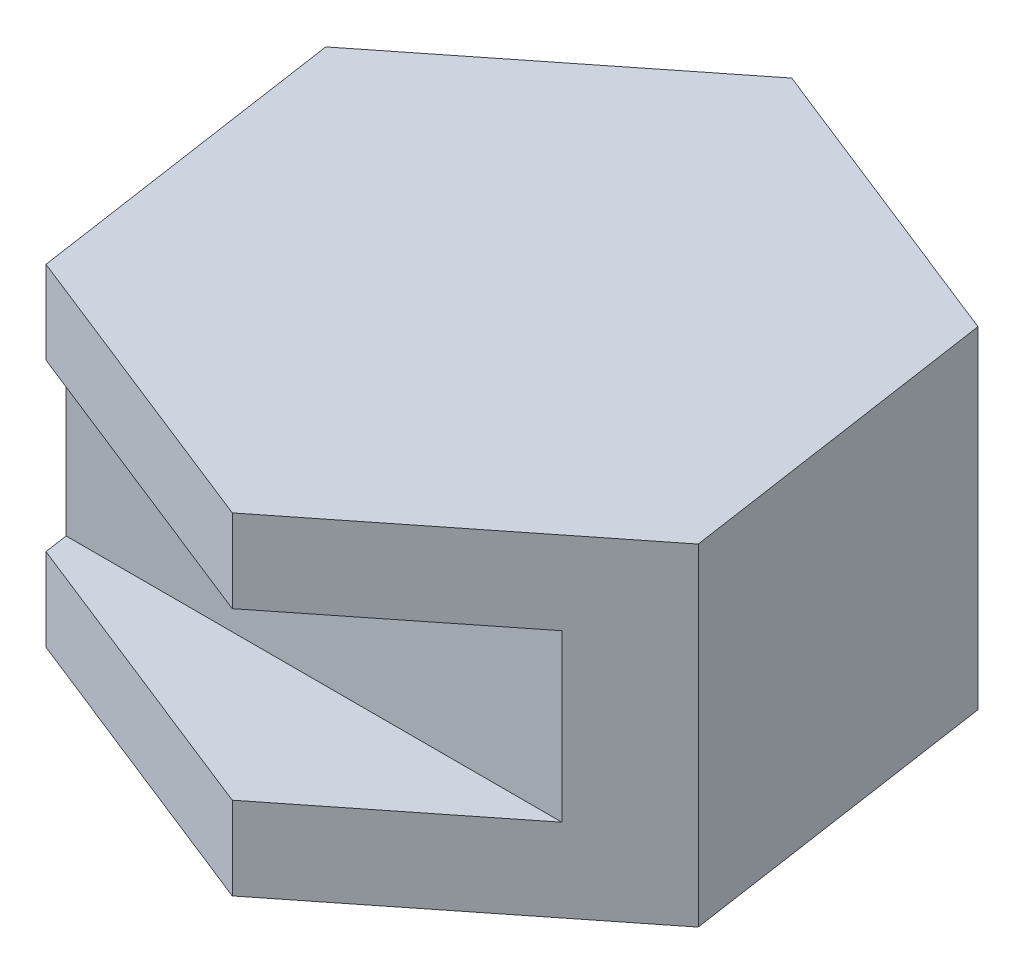
ISO-10303-21;
HEADER;
FILE_DESCRIPTION(('STEP AP214'),'2;1');
FILE_NAME('part.step','',(''),(''),'','','');
FILE_SCHEMA(('AUTOMOTIVE_DESIGN { 1 0 10303 214 1 1 1 1 }'));
ENDSEC;
DATA;
#1=APPLICATION_CONTEXT('core data for automotive mechanical design processes');
#2=APPLICATION_PROTOCOL_DEFINITION('international standard','automotive_design',2000,#1);
#3=PRODUCT_CONTEXT('',#1,'mechanical');
#4=PRODUCT('Part','Part','',(#3));
#5=PRODUCT_RELATED_PRODUCT_CATEGORY('part','',(#4));
#6=PRODUCT_DEFINITION_FORMATION('','',#4);
#7=PRODUCT_DEFINITION_CONTEXT('part definition',#1,'design');
#8=PRODUCT_DEFINITION('design','',#6,#7);
#9=PRODUCT_DEFINITION_SHAPE('','',#8);
#10=(LENGTH_UNIT() NAMED_UNIT(*) SI_UNIT(.MILLI.,.METRE.));
#11=(NAMED_UNIT(*) PLANE_ANGLE_UNIT() SI_UNIT($,.RADIAN.));
#12=(NAMED_UNIT(*) SI_UNIT($,.STERADIAN.) SOLID_ANGLE_UNIT());
#13=UNCERTAINTY_MEASURE_WITH_UNIT(LENGTH_MEASURE(1.E-05),#10,'distance_accuracy_value','');
#14=(GEOMETRIC_REPRESENTATION_CONTEXT(3) GLOBAL_UNCERTAINTY_ASSIGNED_CONTEXT((#13)) GLOBAL_UNIT_ASSIGNED_CONTEXT((#10,
#11,#12)) REPRESENTATION_CONTEXT('',''));
#15=CARTESIAN_POINT('',(0.,0.,0.));
#16=DIRECTION('',(0.,0.,1.));
#17=DIRECTION('',(1.,0.,0.));
#18=AXIS2_PLACEMENT_3D('',#15,#16,#17);
#19=CARTESIAN_POINT('',(4.78052116498155,10.,-15.1706895412915));
#20=DIRECTION('',(0.368239357538517,0.,-0.929731023231784));
#21=DIRECTION('',(-0.929731023231784,0.,-0.368239357538517));
#22=AXIS2_PLACEMENT_3D('',#19,#20,#21);
#23=PLANE('',#22);
#24=DIRECTION('',(0.929731023231784,0.,0.368239357538517));
#25=VECTOR('',#24,1.);
#26=CARTESIAN_POINT('',(4.78052116498155,2.5,-15.1706895412915));
#27=LINE('',#26,#25);
#28=CARTESIAN_POINT('',(4.78052116498155,2.5,-15.1706895412915));
#29=VERTEX_POINT('',#28);
#30=CARTESIAN_POINT('',(14.0778313972994,2.5,-11.4882959659064));
#31=VERTEX_POINT('',#30);
#32=EDGE_CURVE('E49',#29,#31,#27,.T.);
#33=ORIENTED_EDGE('',*,*,#32,.F.);
#34=DIRECTION('',(0.,-1.,0.));
#35=VECTOR('',#34,1.);
#36=CARTESIAN_POINT('',(4.78052116498155,10.,-15.1706895412915));
#37=LINE('',#36,#35);
#38=CARTESIAN_POINT('',(4.78052116498155,0.,-15.1706895412915));
#39=VERTEX_POINT('',#38);
#40=EDGE_CURVE('E123',#29,#39,#37,.T.);
#41=ORIENTED_EDGE('',*,*,#40,.T.);
#42=DIRECTION('',(0.929731023231784,0.,0.368239357538517));
#43=VECTOR('',#42,1.);
#44=CARTESIAN_POINT('',(4.78052116498155,0.,-15.1706895412915));
#45=LINE('',#44,#43);
#46=CARTESIAN_POINT('',(14.0778313972994,0.,-11.4882959659064));
#47=VERTEX_POINT('',#46);
#48=EDGE_CURVE('E142',#39,#47,#45,.T.);
#49=ORIENTED_EDGE('',*,*,#48,.T.);
#50=DIRECTION('',(0.,-1.,0.));
#51=VECTOR('',#50,1.);
#52=CARTESIAN_POINT('',(14.0778313972994,10.,-11.4882959659064));
#53=LINE('',#52,#51);
#54=EDGE_CURVE('E124',#31,#47,#53,.T.);
#55=ORIENTED_EDGE('',*,*,#54,.F.);
#56=EDGE_LOOP('',(#33,#41,#49,#55));
#57=FACE_BOUND('',#56,.T.);
#58=ADVANCED_FACE('F34',(#57),#23,.F.);
#59=CARTESIAN_POINT('',(20.4559241633317,10.,-27.5917096620109));
#60=DIRECTION('',(-0.368239357538516,0.,0.929731023231784));
#61=DIRECTION('',(0.929731023231784,0.,0.368239357538516));
#62=AXIS2_PLACEMENT_3D('',#59,#60,#61);
#63=PLANE('',#62);
#64=DIRECTION('',(-0.929731023231784,0.,-0.368239357538516));
#65=VECTOR('',#64,1.);
#66=CARTESIAN_POINT('',(20.4559241633317,0.,-27.5917096620109));
#67=LINE('',#66,#65);
#68=CARTESIAN_POINT('',(20.4559241633317,0.,-27.5917096620109));
#69=VERTEX_POINT('',#68);
#70=CARTESIAN_POINT('',(11.1586139310139,0.,-31.274103237396));
#71=VERTEX_POINT('',#70);
#72=EDGE_CURVE('E133',#69,#71,#67,.T.);
#73=ORIENTED_EDGE('',*,*,#72,.T.);
#74=DIRECTION('',(0.,-1.,0.));
#75=VECTOR('',#74,1.);
#76=CARTESIAN_POINT('',(11.1586139310139,10.,-31.274103237396));
#77=LINE('',#76,#75);
#78=CARTESIAN_POINT('',(11.1586139310139,10.,-31.274103237396));
#79=VERTEX_POINT('',#78);
#80=EDGE_CURVE('E156',#79,#71,#77,.T.);
#81=ORIENTED_EDGE('',*,*,#80,.F.);
#82=DIRECTION('',(-0.929731023231784,0.,-0.368239357538516));
#83=VECTOR('',#82,1.);
#84=CARTESIAN_POINT('',(20.4559241633317,10.,-27.5917096620109));
#85=LINE('',#84,#83);
#86=CARTESIAN_POINT('',(20.4559241633317,10.,-27.5917096620109));
#87=VERTEX_POINT('',#86);
#88=EDGE_CURVE('E148',#87,#79,#85,.T.);
#89=ORIENTED_EDGE('',*,*,#88,.F.);
#90=DIRECTION('',(0.,-1.,0.));
#91=VECTOR('',#90,1.);
#92=CARTESIAN_POINT('',(20.4559241633317,10.,-27.5917096620109));
#93=LINE('',#92,#91);
#94=EDGE_CURVE('E129',#87,#69,#93,.T.);
#95=ORIENTED_EDGE('',*,*,#94,.T.);
#96=EDGE_LOOP('',(#73,#81,#89,#95));
#97=FACE_BOUND('',#96,.T.);
#98=ADVANCED_FACE('F36',(#97),#63,.F.);
#99=CARTESIAN_POINT('',(11.1586139310139,10.,-31.274103237396));
#100=DIRECTION('',(0.621051006035967,0.,0.783770149917508));
#101=DIRECTION('',(0.783770149917508,0.,-0.621051006035967));
#102=AXIS2_PLACEMENT_3D('',#99,#100,#101);
#103=PLANE('',#102);
#104=DIRECTION('',(-0.783770149917508,0.,0.621051006035967));
#105=VECTOR('',#104,1.);
#106=CARTESIAN_POINT('',(11.1586139310139,0.,-31.274103237396));
#107=LINE('',#106,#105);
#108=CARTESIAN_POINT('',(3.32091243183879,0.,-25.0635931770364));
#109=VERTEX_POINT('',#108);
#110=EDGE_CURVE('E136',#71,#109,#107,.T.);
#111=ORIENTED_EDGE('',*,*,#110,.T.);
#112=DIRECTION('',(0.,-1.,0.));
#113=VECTOR('',#112,1.);
#114=CARTESIAN_POINT('',(3.32091243183879,10.,-25.0635931770364));
#115=LINE('',#114,#113);
#116=CARTESIAN_POINT('',(3.32091243183879,10.,-25.0635931770364));
#117=VERTEX_POINT('',#116);
#118=EDGE_CURVE('E153',#117,#109,#115,.T.);
#119=ORIENTED_EDGE('',*,*,#118,.F.);
#120=DIRECTION('',(-0.783770149917508,0.,0.621051006035967));
#121=VECTOR('',#120,1.);
#122=CARTESIAN_POINT('',(11.1586139310139,10.,-31.274103237396));
#123=LINE('',#122,#121);
#124=EDGE_CURVE('E94',#79,#117,#123,.T.);
#125=ORIENTED_EDGE('',*,*,#124,.F.);
#126=ORIENTED_EDGE('',*,*,#80,.T.);
#127=EDGE_LOOP('',(#111,#119,#125,#126));
#128=FACE_BOUND('',#127,.T.);
#129=ADVANCED_FACE('F194',(#128),#103,.F.);
#130=CARTESIAN_POINT('',(3.32091243183879,10.,-25.0635931770364));
#131=DIRECTION('',(0.989290363574483,0.,-0.145960873314276));
#132=DIRECTION('',(-0.145960873314276,0.,-0.989290363574484));
#133=AXIS2_PLACEMENT_3D('',#130,#131,#132);
#134=PLANE('',#133);
#135=DIRECTION('',(0.,-1.,0.));
#136=VECTOR('',#135,1.);
#137=CARTESIAN_POINT('',(4.67558760680807,10.,-15.8819058800229));
#138=LINE('',#137,#136);
#139=CARTESIAN_POINT('',(4.67558760680807,7.5,-15.8819058800229));
#140=VERTEX_POINT('',#139);
#141=CARTESIAN_POINT('',(4.67558760680807,2.5,-15.8819058800229));
#142=VERTEX_POINT('',#141);
#143=EDGE_CURVE('E137',#140,#142,#138,.T.);
#144=ORIENTED_EDGE('',*,*,#143,.F.);
#145=DIRECTION('',(0.145960873314276,0.,0.989290363574484));
#146=VECTOR('',#145,1.);
#147=CARTESIAN_POINT('',(3.32091243183879,7.5,-25.0635931770364));
#148=LINE('',#147,#146);
#149=CARTESIAN_POINT('',(4.78052116498155,7.5,-15.1706895412915));
#150=VERTEX_POINT('',#149);
#151=EDGE_CURVE('E181',#140,#150,#148,.T.);
#152=ORIENTED_EDGE('',*,*,#151,.T.);
#153=CARTESIAN_POINT('',(4.78052116498155,10.,-15.1706895412915));
#154=VERTEX_POINT('',#153);
#155=EDGE_CURVE('E151',#154,#150,#37,.T.);
#156=ORIENTED_EDGE('',*,*,#155,.F.);
#157=DIRECTION('',(0.145960873314276,0.,0.989290363574484));
#158=VECTOR('',#157,1.);
#159=CARTESIAN_POINT('',(3.32091243183879,10.,-25.0635931770364));
#160=LINE('',#159,#158);
#161=EDGE_CURVE('E110',#117,#154,#160,.T.);
#162=ORIENTED_EDGE('',*,*,#161,.F.);
#163=ORIENTED_EDGE('',*,*,#118,.T.);
#164=DIRECTION('',(0.145960873314276,0.,0.989290363574484));
#165=VECTOR('',#164,1.);
#166=CARTESIAN_POINT('',(3.32091243183879,0.,-25.0635931770364));
#167=LINE('',#166,#165);
#168=EDGE_CURVE('E139',#109,#39,#167,.T.);
#169=ORIENTED_EDGE('',*,*,#168,.T.);
#170=ORIENTED_EDGE('',*,*,#40,.F.);
#171=DIRECTION('',(0.145960873314276,0.,0.989290363574484));
#172=VECTOR('',#171,1.);
#173=CARTESIAN_POINT('',(3.32091243183879,2.5,-25.0635931770364));
#174=LINE('',#173,#172);
#175=EDGE_CURVE('E183',#142,#29,#174,.T.);
#176=ORIENTED_EDGE('',*,*,#175,.F.);
#177=EDGE_LOOP('',(#144,#152,#156,#162,#163,#169,#170,#176));
#178=FACE_BOUND('',#177,.T.);
#179=ADVANCED_FACE('F197',(#178),#134,.F.);
#180=ORIENTED_EDGE('',*,*,#155,.T.);
#181=DIRECTION('',(0.929731023231784,0.,0.368239357538517));
#182=VECTOR('',#181,1.);
#183=CARTESIAN_POINT('',(4.78052116498155,7.5,-15.1706895412915));
#184=LINE('',#183,#182);
#185=CARTESIAN_POINT('',(14.0778313972994,7.5,-11.4882959659064));
#186=VERTEX_POINT('',#185);
#187=EDGE_CURVE('E121',#150,#186,#184,.T.);
#188=ORIENTED_EDGE('',*,*,#187,.T.);
#189=CARTESIAN_POINT('',(14.0778313972994,10.,-11.4882959659064));
#190=VERTEX_POINT('',#189);
#191=EDGE_CURVE('E117',#190,#186,#53,.T.);
#192=ORIENTED_EDGE('',*,*,#191,.F.);
#193=DIRECTION('',(0.929731023231784,0.,0.368239357538517));
#194=VECTOR('',#193,1.);
#195=CARTESIAN_POINT('',(4.78052116498155,10.,-15.1706895412915));
#196=LINE('',#195,#194);
#197=EDGE_CURVE('E103',#154,#190,#196,.T.);
#198=ORIENTED_EDGE('',*,*,#197,.F.);
#199=EDGE_LOOP('',(#180,#188,#192,#198));
#200=FACE_BOUND('',#199,.T.);
#201=ADVANCED_FACE('F118',(#200),#23,.F.);
#202=CARTESIAN_POINT('',(14.0778313972994,10.,-11.4882959659064));
#203=DIRECTION('',(-0.621051006035967,0.,-0.783770149917508));
#204=DIRECTION('',(-0.783770149917508,0.,0.621051006035967));
#205=AXIS2_PLACEMENT_3D('',#202,#203,#204);
#206=PLANE('',#205);
#207=ORIENTED_EDGE('',*,*,#191,.T.);
#208=DIRECTION('',(0.783770149917508,0.,-0.621051006035967));
#209=VECTOR('',#208,1.);
#210=CARTESIAN_POINT('',(14.0778313972994,7.5,-11.4882959659064));
#211=LINE('',#210,#209);
#212=CARTESIAN_POINT('',(19.6225938525537,7.5,-15.8819058800229));
#213=VERTEX_POINT('',#212);
#214=EDGE_CURVE('E11',#186,#213,#211,.T.);
#215=ORIENTED_EDGE('',*,*,#214,.T.);
#216=DIRECTION('',(0.,1.,0.));
#217=VECTOR('',#216,1.);
#218=CARTESIAN_POINT('',(19.6225938525537,10.,-15.8819058800229));
#219=LINE('',#218,#217);
#220=CARTESIAN_POINT('',(19.6225938525537,2.5,-15.8819058800229));
#221=VERTEX_POINT('',#220);
#222=EDGE_CURVE('E42',#221,#213,#219,.T.);
#223=ORIENTED_EDGE('',*,*,#222,.F.);
#224=DIRECTION('',(0.783770149917508,0.,-0.621051006035967));
#225=VECTOR('',#224,1.);
#226=CARTESIAN_POINT('',(14.0778313972994,2.5,-11.4882959659064));
#227=LINE('',#226,#225);
#228=EDGE_CURVE('E158',#31,#221,#227,.T.);
#229=ORIENTED_EDGE('',*,*,#228,.F.);
#230=ORIENTED_EDGE('',*,*,#54,.T.);
#231=DIRECTION('',(0.783770149917508,0.,-0.621051006035967));
#232=VECTOR('',#231,1.);
#233=CARTESIAN_POINT('',(14.0778313972994,0.,-11.4882959659064));
#234=LINE('',#233,#232);
#235=CARTESIAN_POINT('',(21.9155328964745,0.,-17.6988060262661));
#236=VERTEX_POINT('',#235);
#237=EDGE_CURVE('E145',#47,#236,#234,.T.);
#238=ORIENTED_EDGE('',*,*,#237,.T.);
#239=DIRECTION('',(0.,-1.,0.));
#240=VECTOR('',#239,1.);
#241=CARTESIAN_POINT('',(21.9155328964745,10.,-17.6988060262661));
#242=LINE('',#241,#240);
#243=CARTESIAN_POINT('',(21.9155328964745,10.,-17.6988060262661));
#244=VERTEX_POINT('',#243);
#245=EDGE_CURVE('E127',#244,#236,#242,.T.);
#246=ORIENTED_EDGE('',*,*,#245,.F.);
#247=DIRECTION('',(0.783770149917508,0.,-0.621051006035967));
#248=VECTOR('',#247,1.);
#249=CARTESIAN_POINT('',(14.0778313972994,10.,-11.4882959659064));
#250=LINE('',#249,#248);
#251=EDGE_CURVE('E107',#190,#244,#250,.T.);
#252=ORIENTED_EDGE('',*,*,#251,.F.);
#253=EDGE_LOOP('',(#207,#215,#223,#229,#230,#238,#246,#252));
#254=FACE_BOUND('',#253,.T.);
#255=ADVANCED_FACE('F126',(#254),#206,.F.);
#256=CARTESIAN_POINT('',(21.9155328964745,10.,-17.6988060262661));
#257=DIRECTION('',(-0.989290363574484,0.,0.145960873314276));
#258=DIRECTION('',(0.145960873314276,0.,0.989290363574484));
#259=AXIS2_PLACEMENT_3D('',#256,#257,#258);
#260=PLANE('',#259);
#261=DIRECTION('',(-0.145960873314276,0.,-0.989290363574484));
#262=VECTOR('',#261,1.);
#263=CARTESIAN_POINT('',(21.9155328964745,0.,-17.6988060262661));
#264=LINE('',#263,#262);
#265=EDGE_CURVE('E85',#236,#69,#264,.T.);
#266=ORIENTED_EDGE('',*,*,#265,.T.);
#267=ORIENTED_EDGE('',*,*,#94,.F.);
#268=DIRECTION('',(-0.145960873314276,0.,-0.989290363574484));
#269=VECTOR('',#268,1.);
#270=CARTESIAN_POINT('',(21.9155328964745,10.,-17.6988060262661));
#271=LINE('',#270,#269);
#272=EDGE_CURVE('E58',#244,#87,#271,.T.);
#273=ORIENTED_EDGE('',*,*,#272,.F.);
#274=ORIENTED_EDGE('',*,*,#245,.T.);
#275=EDGE_LOOP('',(#266,#267,#273,#274));
#276=FACE_BOUND('',#275,.T.);
#277=ADVANCED_FACE('F213',(#276),#260,.F.);
#278=CARTESIAN_POINT('',(0.,10.,0.));
#279=DIRECTION('',(0.,1.,0.));
#280=DIRECTION('',(0.,0.,1.));
#281=AXIS2_PLACEMENT_3D('',#278,#279,#280);
#282=PLANE('',#281);
#283=ORIENTED_EDGE('',*,*,#88,.T.);
#284=ORIENTED_EDGE('',*,*,#124,.T.);
#285=ORIENTED_EDGE('',*,*,#161,.T.);
#286=ORIENTED_EDGE('',*,*,#197,.T.);
#287=ORIENTED_EDGE('',*,*,#251,.T.);
#288=ORIENTED_EDGE('',*,*,#272,.T.);
#289=EDGE_LOOP('',(#283,#284,#285,#286,#287,#288));
#290=FACE_BOUND('',#289,.T.);
#291=ADVANCED_FACE('F105',(#290),#282,.T.);
#292=CARTESIAN_POINT('',(0.,0.,0.));
#293=DIRECTION('',(0.,1.,0.));
#294=DIRECTION('',(0.,0.,1.));
#295=AXIS2_PLACEMENT_3D('',#292,#293,#294);
#296=PLANE('',#295);
#297=ORIENTED_EDGE('',*,*,#72,.F.);
#298=ORIENTED_EDGE('',*,*,#265,.F.);
#299=ORIENTED_EDGE('',*,*,#237,.F.);
#300=ORIENTED_EDGE('',*,*,#48,.F.);
#301=ORIENTED_EDGE('',*,*,#168,.F.);
#302=ORIENTED_EDGE('',*,*,#110,.F.);
#303=EDGE_LOOP('',(#297,#298,#299,#300,#301,#302));
#304=FACE_BOUND('',#303,.T.);
#305=ADVANCED_FACE('F212',(#304),#296,.F.);
#306=CARTESIAN_POINT('',(-2.75181442294586,7.5,-15.8819058800229));
#307=DIRECTION('',(0.,0.,1.));
#308=DIRECTION('',(1.,0.,0.));
#309=AXIS2_PLACEMENT_3D('',#306,#307,#308);
#310=PLANE('',#309);
#311=ORIENTED_EDGE('',*,*,#143,.T.);
#312=DIRECTION('',(-1.,0.,0.));
#313=VECTOR('',#312,1.);
#314=CARTESIAN_POINT('',(-2.75181442294586,2.5,-15.8819058800229));
#315=LINE('',#314,#313);
#316=EDGE_CURVE('E173',#221,#142,#315,.T.);
#317=ORIENTED_EDGE('',*,*,#316,.F.);
#318=ORIENTED_EDGE('',*,*,#222,.T.);
#319=DIRECTION('',(-1.,0.,0.));
#320=VECTOR('',#319,1.);
#321=CARTESIAN_POINT('',(-2.75181442294586,7.5,-15.8819058800229));
#322=LINE('',#321,#320);
#323=EDGE_CURVE('E169',#213,#140,#322,.T.);
#324=ORIENTED_EDGE('',*,*,#323,.T.);
#325=EDGE_LOOP('',(#311,#317,#318,#324));
#326=FACE_BOUND('',#325,.T.);
#327=ADVANCED_FACE('F167',(#326),#310,.T.);
#328=CARTESIAN_POINT('',(0.,7.5,0.));
#329=DIRECTION('',(0.,1.,0.));
#330=DIRECTION('',(0.,0.,1.));
#331=AXIS2_PLACEMENT_3D('',#328,#329,#330);
#332=PLANE('',#331);
#333=ORIENTED_EDGE('',*,*,#323,.F.);
#334=ORIENTED_EDGE('',*,*,#214,.F.);
#335=ORIENTED_EDGE('',*,*,#187,.F.);
#336=ORIENTED_EDGE('',*,*,#151,.F.);
#337=EDGE_LOOP('',(#333,#334,#335,#336));
#338=FACE_BOUND('',#337,.T.);
#339=ADVANCED_FACE('F179',(#338),#332,.F.);
#340=CARTESIAN_POINT('',(0.,2.5,0.));
#341=DIRECTION('',(0.,1.,0.));
#342=DIRECTION('',(0.,0.,1.));
#343=AXIS2_PLACEMENT_3D('',#340,#341,#342);
#344=PLANE('',#343);
#345=ORIENTED_EDGE('',*,*,#175,.T.);
#346=ORIENTED_EDGE('',*,*,#32,.T.);
#347=ORIENTED_EDGE('',*,*,#228,.T.);
#348=ORIENTED_EDGE('',*,*,#316,.T.);
#349=EDGE_LOOP('',(#345,#346,#347,#348));
#350=FACE_BOUND('',#349,.T.);
#351=ADVANCED_FACE('F203',(#350),#344,.T.);
#352=CLOSED_SHELL('',(#58,#98,#129,#179,#201,#255,#277,#291,#305,#327,#339,#351));
#353=MANIFOLD_SOLID_BREP('B2',#352);
#354=ADVANCED_BREP_SHAPE_REPRESENTATION('',(#18,#353),#14);
#355=SHAPE_DEFINITION_REPRESENTATION(#9,#354);
ENDSEC;
END-ISO-10303-21;
